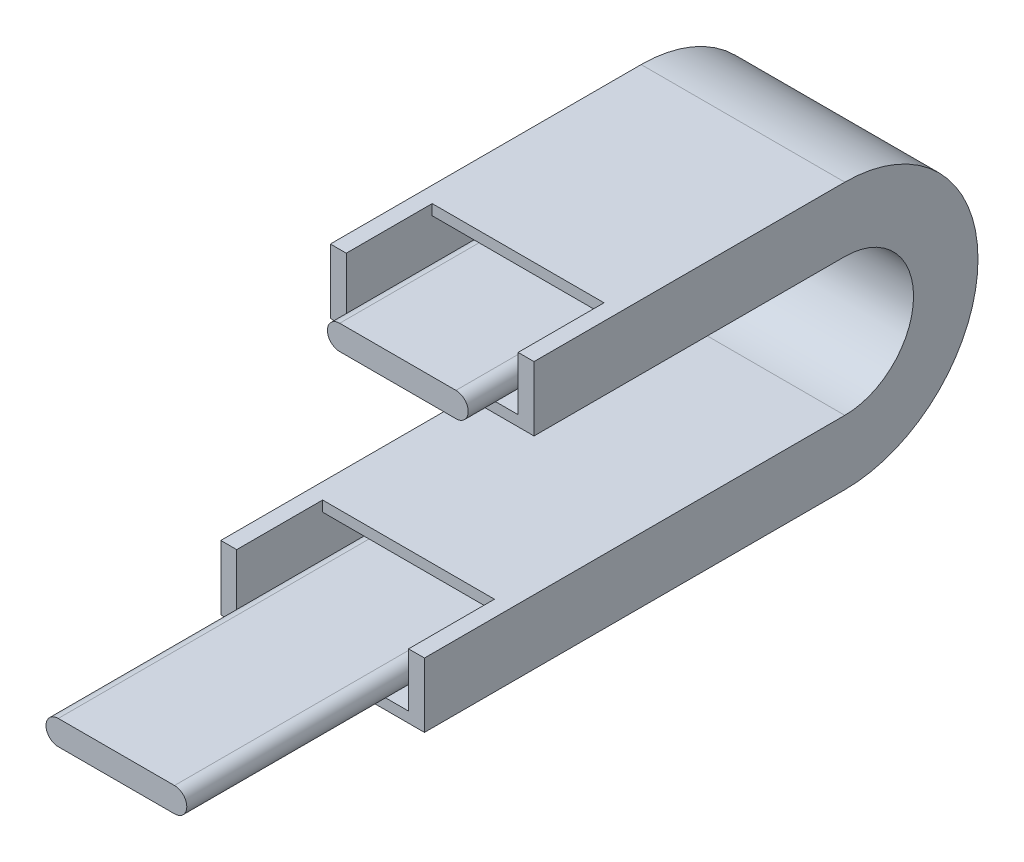
ISO-10303-21;
HEADER;
FILE_DESCRIPTION(('STEP AP214'),'2;1');
FILE_NAME('part.step','',(''),(''),'','','');
FILE_SCHEMA(('AUTOMOTIVE_DESIGN { 1 0 10303 214 1 1 1 1 }'));
ENDSEC;
DATA;
#1=APPLICATION_CONTEXT('core data for automotive mechanical design processes');
#2=APPLICATION_PROTOCOL_DEFINITION('international standard','automotive_design',2000,#1);
#3=PRODUCT_CONTEXT('',#1,'mechanical');
#4=PRODUCT('Part','Part','',(#3));
#5=PRODUCT_RELATED_PRODUCT_CATEGORY('part','',(#4));
#6=PRODUCT_DEFINITION_FORMATION('','',#4);
#7=PRODUCT_DEFINITION_CONTEXT('part definition',#1,'design');
#8=PRODUCT_DEFINITION('design','',#6,#7);
#9=PRODUCT_DEFINITION_SHAPE('','',#8);
#10=(LENGTH_UNIT() NAMED_UNIT(*) SI_UNIT(.MILLI.,.METRE.));
#11=(NAMED_UNIT(*) PLANE_ANGLE_UNIT() SI_UNIT($,.RADIAN.));
#12=(NAMED_UNIT(*) SI_UNIT($,.STERADIAN.) SOLID_ANGLE_UNIT());
#13=UNCERTAINTY_MEASURE_WITH_UNIT(LENGTH_MEASURE(1.E-05),#10,'distance_accuracy_value','');
#14=(GEOMETRIC_REPRESENTATION_CONTEXT(3) GLOBAL_UNCERTAINTY_ASSIGNED_CONTEXT((#13)) GLOBAL_UNIT_ASSIGNED_CONTEXT((#10,
#11,#12)) REPRESENTATION_CONTEXT('',''));
#15=CARTESIAN_POINT('',(0.,0.,0.));
#16=DIRECTION('',(0.,0.,1.));
#17=DIRECTION('',(1.,0.,0.));
#18=AXIS2_PLACEMENT_3D('',#15,#16,#17);
#19=CARTESIAN_POINT('',(-13.5255,41.8999999999999,-75.8362863203199));
#20=DIRECTION('',(0.,1.,0.));
#21=DIRECTION('',(0.,0.,1.));
#22=AXIS2_PLACEMENT_3D('',#19,#20,#21);
#23=PLANE('',#22);
#24=DIRECTION('',(-1.,0.,0.));
#25=VECTOR('',#24,1.);
#26=CARTESIAN_POINT('',(-13.5255,41.8999999999999,-75.8362863203199));
#27=LINE('',#26,#25);
#28=CARTESIAN_POINT('',(13.5255,41.8999999999999,-75.8362863203199));
#29=VERTEX_POINT('',#28);
#30=CARTESIAN_POINT('',(-13.5255,41.8999999999999,-75.8362863203199));
#31=VERTEX_POINT('',#30);
#32=EDGE_CURVE('E167',#29,#31,#27,.T.);
#33=ORIENTED_EDGE('',*,*,#32,.F.);
#34=DIRECTION('',(0.,0.,1.));
#35=VECTOR('',#34,1.);
#36=CARTESIAN_POINT('',(13.5255,41.8999999999999,-75.8362863203199));
#37=LINE('',#36,#35);
#38=CARTESIAN_POINT('',(13.5255,41.8999999999999,4.50000000000001));
#39=VERTEX_POINT('',#38);
#40=EDGE_CURVE('E54',#29,#39,#37,.T.);
#41=ORIENTED_EDGE('',*,*,#40,.T.);
#42=DIRECTION('',(1.,0.,0.));
#43=VECTOR('',#42,1.);
#44=CARTESIAN_POINT('',(-13.5255,41.8999999999999,4.50000000000001));
#45=LINE('',#44,#43);
#46=CARTESIAN_POINT('',(-13.5255,41.8999999999999,4.50000000000001));
#47=VERTEX_POINT('',#46);
#48=EDGE_CURVE('E115',#47,#39,#45,.T.);
#49=ORIENTED_EDGE('',*,*,#48,.F.);
#50=DIRECTION('',(0.,0.,1.));
#51=VECTOR('',#50,1.);
#52=CARTESIAN_POINT('',(-13.5255,41.8999999999999,-75.8362863203199));
#53=LINE('',#52,#51);
#54=EDGE_CURVE('E13',#31,#47,#53,.T.);
#55=ORIENTED_EDGE('',*,*,#54,.F.);
#56=EDGE_LOOP('',(#33,#41,#49,#55));
#57=FACE_BOUND('',#56,.T.);
#58=ADVANCED_FACE('F47',(#57),#23,.F.);
#59=CARTESIAN_POINT('',(13.5255,44.7575,-75.8362863203199));
#60=DIRECTION('',(0.,0.,1.));
#61=DIRECTION('',(0.,-1.,0.));
#62=AXIS2_PLACEMENT_3D('',#59,#60,#61);
#63=CYLINDRICAL_SURFACE('',#62,2.8575);
#64=CARTESIAN_POINT('',(13.5255,44.7575,-75.8362863203199));
#65=DIRECTION('',(0.,0.,-1.));
#66=DIRECTION('',(1.,0.,0.));
#67=AXIS2_PLACEMENT_3D('',#64,#65,#66);
#68=CIRCLE('',#67,2.8575);
#69=CARTESIAN_POINT('',(13.5255,47.615,-75.8362863203199));
#70=VERTEX_POINT('',#69);
#71=EDGE_CURVE('E164',#70,#29,#68,.T.);
#72=ORIENTED_EDGE('',*,*,#71,.F.);
#73=DIRECTION('',(0.,0.,1.));
#74=VECTOR('',#73,1.);
#75=CARTESIAN_POINT('',(13.5255,47.615,-75.8362863203199));
#76=LINE('',#75,#74);
#77=CARTESIAN_POINT('',(13.5255,47.6149999999999,4.50000000000001));
#78=VERTEX_POINT('',#77);
#79=EDGE_CURVE('E183',#70,#78,#76,.T.);
#80=ORIENTED_EDGE('',*,*,#79,.T.);
#81=CARTESIAN_POINT('',(13.5255,44.7574999999999,4.50000000000001));
#82=DIRECTION('',(0.,0.,1.));
#83=DIRECTION('',(1.,0.,0.));
#84=AXIS2_PLACEMENT_3D('',#81,#82,#83);
#85=CIRCLE('',#84,2.8575);
#86=EDGE_CURVE('E118',#39,#78,#85,.T.);
#87=ORIENTED_EDGE('',*,*,#86,.F.);
#88=ORIENTED_EDGE('',*,*,#40,.F.);
#89=EDGE_LOOP('',(#72,#80,#87,#88));
#90=FACE_BOUND('',#89,.T.);
#91=ADVANCED_FACE('F184',(#90),#63,.T.);
#92=CARTESIAN_POINT('',(-13.5255,47.615,-75.8362863203199));
#93=DIRECTION('',(0.,-1.,0.));
#94=DIRECTION('',(0.,0.,-1.));
#95=AXIS2_PLACEMENT_3D('',#92,#93,#94);
#96=PLANE('',#95);
#97=DIRECTION('',(1.,0.,0.));
#98=VECTOR('',#97,1.);
#99=CARTESIAN_POINT('',(-13.5255,47.615,-75.8362863203199));
#100=LINE('',#99,#98);
#101=CARTESIAN_POINT('',(-13.5255,47.615,-75.8362863203199));
#102=VERTEX_POINT('',#101);
#103=EDGE_CURVE('E161',#102,#70,#100,.T.);
#104=ORIENTED_EDGE('',*,*,#103,.F.);
#105=DIRECTION('',(0.,0.,1.));
#106=VECTOR('',#105,1.);
#107=CARTESIAN_POINT('',(-13.5255,47.615,-75.8362863203199));
#108=LINE('',#107,#106);
#109=CARTESIAN_POINT('',(-13.5255,47.6149999999999,4.50000000000001));
#110=VERTEX_POINT('',#109);
#111=EDGE_CURVE('E181',#102,#110,#108,.T.);
#112=ORIENTED_EDGE('',*,*,#111,.T.);
#113=DIRECTION('',(-1.,0.,0.));
#114=VECTOR('',#113,1.);
#115=CARTESIAN_POINT('',(13.5255,47.6149999999999,4.50000000000001));
#116=LINE('',#115,#114);
#117=EDGE_CURVE('E123',#78,#110,#116,.T.);
#118=ORIENTED_EDGE('',*,*,#117,.F.);
#119=ORIENTED_EDGE('',*,*,#79,.F.);
#120=EDGE_LOOP('',(#104,#112,#118,#119));
#121=FACE_BOUND('',#120,.T.);
#122=ADVANCED_FACE('F187',(#121),#96,.F.);
#123=CARTESIAN_POINT('',(-13.5255,44.7575,-75.8362863203199));
#124=DIRECTION('',(0.,0.,1.));
#125=DIRECTION('',(0.,-1.,0.));
#126=AXIS2_PLACEMENT_3D('',#123,#124,#125);
#127=CYLINDRICAL_SURFACE('',#126,2.8575);
#128=CARTESIAN_POINT('',(-13.5255,44.7575,-75.8362863203199));
#129=DIRECTION('',(0.,0.,-1.));
#130=DIRECTION('',(1.,0.,0.));
#131=AXIS2_PLACEMENT_3D('',#128,#129,#130);
#132=CIRCLE('',#131,2.8575);
#133=EDGE_CURVE('E112',#31,#102,#132,.T.);
#134=ORIENTED_EDGE('',*,*,#133,.F.);
#135=ORIENTED_EDGE('',*,*,#54,.T.);
#136=CARTESIAN_POINT('',(-13.5255,44.7574999999999,4.50000000000001));
#137=DIRECTION('',(0.,0.,1.));
#138=DIRECTION('',(1.,0.,0.));
#139=AXIS2_PLACEMENT_3D('',#136,#137,#138);
#140=CIRCLE('',#139,2.8575);
#141=EDGE_CURVE('E110',#110,#47,#140,.T.);
#142=ORIENTED_EDGE('',*,*,#141,.F.);
#143=ORIENTED_EDGE('',*,*,#111,.F.);
#144=EDGE_LOOP('',(#134,#135,#142,#143));
#145=FACE_BOUND('',#144,.T.);
#146=ADVANCED_FACE('F108',(#145),#127,.T.);
#147=CARTESIAN_POINT('',(0.,21.3075,-75.8362863203199));
#148=DIRECTION('',(1.,0.,0.));
#149=DIRECTION('',(0.,0.,-1.));
#150=AXIS2_PLACEMENT_3D('',#147,#148,#149);
#151=CYLINDRICAL_SURFACE('',#150,20.5925);
#152=DIRECTION('',(-1.,0.,0.));
#153=VECTOR('',#152,1.);
#154=CARTESIAN_POINT('',(-13.5255,0.715000000000009,-75.8362863203199));
#155=LINE('',#154,#153);
#156=CARTESIAN_POINT('',(13.5255,0.715000000000009,-75.8362863203199));
#157=VERTEX_POINT('',#156);
#158=CARTESIAN_POINT('',(-13.5255,0.715000000000009,-75.8362863203199));
#159=VERTEX_POINT('',#158);
#160=EDGE_CURVE('E149',#157,#159,#155,.T.);
#161=ORIENTED_EDGE('',*,*,#160,.F.);
#162=CARTESIAN_POINT('',(13.5255,21.3075,-75.8362863203199));
#163=DIRECTION('',(1.,0.,0.));
#164=DIRECTION('',(0.,0.,-1.));
#165=AXIS2_PLACEMENT_3D('',#162,#163,#164);
#166=CIRCLE('',#165,20.5925);
#167=EDGE_CURVE('E175',#157,#29,#166,.T.);
#168=ORIENTED_EDGE('',*,*,#167,.T.);
#169=ORIENTED_EDGE('',*,*,#32,.T.);
#170=CARTESIAN_POINT('',(-13.5255,21.3075,-75.8362863203199));
#171=DIRECTION('',(1.,0.,0.));
#172=DIRECTION('',(0.,0.,-1.));
#173=AXIS2_PLACEMENT_3D('',#170,#171,#172);
#174=CIRCLE('',#173,20.5925);
#175=EDGE_CURVE('E178',#159,#31,#174,.T.);
#176=ORIENTED_EDGE('',*,*,#175,.F.);
#177=EDGE_LOOP('',(#161,#168,#169,#176));
#178=FACE_BOUND('',#177,.T.);
#179=ADVANCED_FACE('F209',(#178),#151,.F.);
#180=CARTESIAN_POINT('',(13.5255,21.3075,-75.8362863203199));
#181=DIRECTION('',(1.,0.,0.));
#182=DIRECTION('',(0.,0.,-1.));
#183=AXIS2_PLACEMENT_3D('',#180,#181,#182);
#184=TOROIDAL_SURFACE('',#183,23.45,2.8575);
#185=CARTESIAN_POINT('',(13.5255,-2.14249999999999,-75.8362863203199));
#186=DIRECTION('',(0.,0.,1.));
#187=DIRECTION('',(1.,0.,0.));
#188=AXIS2_PLACEMENT_3D('',#185,#186,#187);
#189=CIRCLE('',#188,2.8575);
#190=CARTESIAN_POINT('',(13.5255,-4.99999999999999,-75.8362863203199));
#191=VERTEX_POINT('',#190);
#192=EDGE_CURVE('E146',#191,#157,#189,.T.);
#193=ORIENTED_EDGE('',*,*,#192,.F.);
#194=CARTESIAN_POINT('',(13.5255,21.3075,-75.8362863203199));
#195=DIRECTION('',(1.,0.,0.));
#196=DIRECTION('',(0.,0.,-1.));
#197=AXIS2_PLACEMENT_3D('',#194,#195,#196);
#198=CIRCLE('',#197,26.3075);
#199=EDGE_CURVE('E172',#191,#70,#198,.T.);
#200=ORIENTED_EDGE('',*,*,#199,.T.);
#201=ORIENTED_EDGE('',*,*,#71,.T.);
#202=ORIENTED_EDGE('',*,*,#167,.F.);
#203=EDGE_LOOP('',(#193,#200,#201,#202));
#204=FACE_BOUND('',#203,.T.);
#205=ADVANCED_FACE('F211',(#204),#184,.T.);
#206=CARTESIAN_POINT('',(0.,21.3075,-75.8362863203199));
#207=DIRECTION('',(1.,0.,0.));
#208=DIRECTION('',(0.,0.,-1.));
#209=AXIS2_PLACEMENT_3D('',#206,#207,#208);
#210=CYLINDRICAL_SURFACE('',#209,26.3075);
#211=DIRECTION('',(1.,0.,0.));
#212=VECTOR('',#211,1.);
#213=CARTESIAN_POINT('',(-13.5255,-4.99999999999999,-75.8362863203199));
#214=LINE('',#213,#212);
#215=CARTESIAN_POINT('',(-13.5255,-4.99999999999999,-75.8362863203199));
#216=VERTEX_POINT('',#215);
#217=EDGE_CURVE('E143',#216,#191,#214,.T.);
#218=ORIENTED_EDGE('',*,*,#217,.F.);
#219=CARTESIAN_POINT('',(-13.5255,21.3075,-75.8362863203199));
#220=DIRECTION('',(1.,0.,0.));
#221=DIRECTION('',(0.,0.,-1.));
#222=AXIS2_PLACEMENT_3D('',#219,#220,#221);
#223=CIRCLE('',#222,26.3075);
#224=EDGE_CURVE('E169',#216,#102,#223,.T.);
#225=ORIENTED_EDGE('',*,*,#224,.T.);
#226=ORIENTED_EDGE('',*,*,#103,.T.);
#227=ORIENTED_EDGE('',*,*,#199,.F.);
#228=EDGE_LOOP('',(#218,#225,#226,#227));
#229=FACE_BOUND('',#228,.T.);
#230=ADVANCED_FACE('F193',(#229),#210,.T.);
#231=CARTESIAN_POINT('',(-13.5255,21.3075,-75.8362863203199));
#232=DIRECTION('',(1.,0.,0.));
#233=DIRECTION('',(0.,0.,-1.));
#234=AXIS2_PLACEMENT_3D('',#231,#232,#233);
#235=TOROIDAL_SURFACE('',#234,23.45,2.8575);
#236=CARTESIAN_POINT('',(-13.5255,-2.14249999999999,-75.8362863203199));
#237=DIRECTION('',(0.,0.,1.));
#238=DIRECTION('',(1.,0.,0.));
#239=AXIS2_PLACEMENT_3D('',#236,#237,#238);
#240=CIRCLE('',#239,2.8575);
#241=EDGE_CURVE('E132',#159,#216,#240,.T.);
#242=ORIENTED_EDGE('',*,*,#241,.F.);
#243=ORIENTED_EDGE('',*,*,#175,.T.);
#244=ORIENTED_EDGE('',*,*,#133,.T.);
#245=ORIENTED_EDGE('',*,*,#224,.F.);
#246=EDGE_LOOP('',(#242,#243,#244,#245));
#247=FACE_BOUND('',#246,.T.);
#248=ADVANCED_FACE('F191',(#247),#235,.T.);
#249=CARTESIAN_POINT('',(-13.5255,-2.14249999999999,-75.8362863203199));
#250=DIRECTION('',(0.,0.,1.));
#251=DIRECTION('',(0.,-1.,0.));
#252=AXIS2_PLACEMENT_3D('',#249,#250,#251);
#253=CYLINDRICAL_SURFACE('',#252,2.8575);
#254=DIRECTION('',(0.,0.,1.));
#255=VECTOR('',#254,1.);
#256=CARTESIAN_POINT('',(-13.5255,-4.99999999999999,-75.8362863203199));
#257=LINE('',#256,#255);
#258=CARTESIAN_POINT('',(-13.5255,-4.99999999999999,70.));
#259=VERTEX_POINT('',#258);
#260=EDGE_CURVE('E152',#216,#259,#257,.T.);
#261=ORIENTED_EDGE('',*,*,#260,.T.);
#262=CARTESIAN_POINT('',(-13.5255,-2.14249999999999,70.));
#263=DIRECTION('',(0.,0.,1.));
#264=DIRECTION('',(1.,0.,0.));
#265=AXIS2_PLACEMENT_3D('',#262,#263,#264);
#266=CIRCLE('',#265,2.8575);
#267=CARTESIAN_POINT('',(-13.5255,0.714999999999995,70.));
#268=VERTEX_POINT('',#267);
#269=EDGE_CURVE('E129',#268,#259,#266,.T.);
#270=ORIENTED_EDGE('',*,*,#269,.F.);
#271=DIRECTION('',(0.,0.,1.));
#272=VECTOR('',#271,1.);
#273=CARTESIAN_POINT('',(-13.5255,0.715000000000009,-75.8362863203199));
#274=LINE('',#273,#272);
#275=EDGE_CURVE('E153',#159,#268,#274,.T.);
#276=ORIENTED_EDGE('',*,*,#275,.F.);
#277=ORIENTED_EDGE('',*,*,#241,.T.);
#278=EDGE_LOOP('',(#261,#270,#276,#277));
#279=FACE_BOUND('',#278,.T.);
#280=ADVANCED_FACE('F202',(#279),#253,.T.);
#281=CARTESIAN_POINT('',(-13.5255,0.715000000000009,-75.8362863203199));
#282=DIRECTION('',(0.,1.,0.));
#283=DIRECTION('',(0.,0.,1.));
#284=AXIS2_PLACEMENT_3D('',#281,#282,#283);
#285=PLANE('',#284);
#286=ORIENTED_EDGE('',*,*,#275,.T.);
#287=DIRECTION('',(-1.,0.,0.));
#288=VECTOR('',#287,1.);
#289=CARTESIAN_POINT('',(13.5255,0.714999999999995,70.));
#290=LINE('',#289,#288);
#291=CARTESIAN_POINT('',(13.5255,0.714999999999995,70.));
#292=VERTEX_POINT('',#291);
#293=EDGE_CURVE('E133',#292,#268,#290,.T.);
#294=ORIENTED_EDGE('',*,*,#293,.F.);
#295=DIRECTION('',(0.,0.,1.));
#296=VECTOR('',#295,1.);
#297=CARTESIAN_POINT('',(13.5255,0.715000000000009,-75.8362863203199));
#298=LINE('',#297,#296);
#299=EDGE_CURVE('E155',#157,#292,#298,.T.);
#300=ORIENTED_EDGE('',*,*,#299,.F.);
#301=ORIENTED_EDGE('',*,*,#160,.T.);
#302=EDGE_LOOP('',(#286,#294,#300,#301));
#303=FACE_BOUND('',#302,.T.);
#304=ADVANCED_FACE('F207',(#303),#285,.T.);
#305=CARTESIAN_POINT('',(13.5255,-2.14249999999999,-75.8362863203199));
#306=DIRECTION('',(0.,0.,1.));
#307=DIRECTION('',(0.,-1.,0.));
#308=AXIS2_PLACEMENT_3D('',#305,#306,#307);
#309=CYLINDRICAL_SURFACE('',#308,2.8575);
#310=ORIENTED_EDGE('',*,*,#299,.T.);
#311=CARTESIAN_POINT('',(13.5255,-2.14249999999999,70.));
#312=DIRECTION('',(0.,0.,1.));
#313=DIRECTION('',(1.,0.,0.));
#314=AXIS2_PLACEMENT_3D('',#311,#312,#313);
#315=CIRCLE('',#314,2.8575);
#316=CARTESIAN_POINT('',(13.5255,-5.,70.));
#317=VERTEX_POINT('',#316);
#318=EDGE_CURVE('E136',#317,#292,#315,.T.);
#319=ORIENTED_EDGE('',*,*,#318,.F.);
#320=DIRECTION('',(0.,0.,1.));
#321=VECTOR('',#320,1.);
#322=CARTESIAN_POINT('',(13.5255,-4.99999999999999,-75.8362863203199));
#323=LINE('',#322,#321);
#324=EDGE_CURVE('E157',#191,#317,#323,.T.);
#325=ORIENTED_EDGE('',*,*,#324,.F.);
#326=ORIENTED_EDGE('',*,*,#192,.T.);
#327=EDGE_LOOP('',(#310,#319,#325,#326));
#328=FACE_BOUND('',#327,.T.);
#329=ADVANCED_FACE('F215',(#328),#309,.T.);
#330=CARTESIAN_POINT('',(-13.5255,-4.99999999999999,-75.8362863203199));
#331=DIRECTION('',(0.,-1.,0.));
#332=DIRECTION('',(0.,0.,-1.));
#333=AXIS2_PLACEMENT_3D('',#330,#331,#332);
#334=PLANE('',#333);
#335=ORIENTED_EDGE('',*,*,#324,.T.);
#336=DIRECTION('',(1.,0.,0.));
#337=VECTOR('',#336,1.);
#338=CARTESIAN_POINT('',(-13.5255,-5.,70.));
#339=LINE('',#338,#337);
#340=EDGE_CURVE('E128',#259,#317,#339,.T.);
#341=ORIENTED_EDGE('',*,*,#340,.F.);
#342=ORIENTED_EDGE('',*,*,#260,.F.);
#343=ORIENTED_EDGE('',*,*,#217,.T.);
#344=EDGE_LOOP('',(#335,#341,#342,#343));
#345=FACE_BOUND('',#344,.T.);
#346=ADVANCED_FACE('F198',(#345),#334,.T.);
#347=CARTESIAN_POINT('',(0.,0.,70.));
#348=DIRECTION('',(0.,0.,1.));
#349=DIRECTION('',(1.,0.,0.));
#350=AXIS2_PLACEMENT_3D('',#347,#348,#349);
#351=PLANE('',#350);
#352=ORIENTED_EDGE('',*,*,#340,.T.);
#353=ORIENTED_EDGE('',*,*,#318,.T.);
#354=ORIENTED_EDGE('',*,*,#293,.T.);
#355=ORIENTED_EDGE('',*,*,#269,.T.);
#356=EDGE_LOOP('',(#352,#353,#354,#355));
#357=FACE_BOUND('',#356,.T.);
#358=ADVANCED_FACE('F217',(#357),#351,.T.);
#359=CARTESIAN_POINT('',(-13.5255,44.7574999999999,4.50000000000001));
#360=DIRECTION('',(0.,0.,1.));
#361=DIRECTION('',(1.,0.,0.));
#362=AXIS2_PLACEMENT_3D('',#359,#360,#361);
#363=PLANE('',#362);
#364=ORIENTED_EDGE('',*,*,#141,.T.);
#365=ORIENTED_EDGE('',*,*,#48,.T.);
#366=ORIENTED_EDGE('',*,*,#86,.T.);
#367=ORIENTED_EDGE('',*,*,#117,.T.);
#368=EDGE_LOOP('',(#364,#365,#366,#367));
#369=FACE_BOUND('',#368,.T.);
#370=ADVANCED_FACE('F121',(#369),#363,.T.);
#371=CLOSED_SHELL('',(#58,#91,#122,#146,#179,#205,#230,#248,#280,#304,#329,#346,#358,#370));
#372=MANIFOLD_SOLID_BREP('B2',#371);
#373=CARTESIAN_POINT('',(-50.3270539113887,54.5,-3.5));
#374=DIRECTION('',(0.,0.,1.));
#375=DIRECTION('',(0.,-1.,0.));
#376=AXIS2_PLACEMENT_3D('',#373,#374,#375);
#377=PLANE('',#376);
#378=DIRECTION('',(0.,1.,0.));
#379=VECTOR('',#378,1.);
#380=CARTESIAN_POINT('',(-20.,41.95,-3.5));
#381=LINE('',#380,#379);
#382=CARTESIAN_POINT('',(-20.,41.95,-3.5));
#383=VERTEX_POINT('',#382);
#384=CARTESIAN_POINT('',(-20.,54.5,-3.5));
#385=VERTEX_POINT('',#384);
#386=EDGE_CURVE('E635',#383,#385,#381,.T.);
#387=ORIENTED_EDGE('',*,*,#386,.T.);
#388=DIRECTION('',(1.,0.,0.));
#389=VECTOR('',#388,1.);
#390=CARTESIAN_POINT('',(-50.3270539113887,54.5,-3.5));
#391=LINE('',#390,#389);
#392=CARTESIAN_POINT('',(-23.7,54.5,-3.5));
#393=VERTEX_POINT('',#392);
#394=EDGE_CURVE('E632',#393,#385,#391,.T.);
#395=ORIENTED_EDGE('',*,*,#394,.F.);
#396=DIRECTION('',(0.,-1.,0.));
#397=VECTOR('',#396,1.);
#398=CARTESIAN_POINT('',(-23.7,54.5,-3.5));
#399=LINE('',#398,#397);
#400=CARTESIAN_POINT('',(-23.7,39.5,-3.5));
#401=VERTEX_POINT('',#400);
#402=EDGE_CURVE('E626',#393,#401,#399,.T.);
#403=ORIENTED_EDGE('',*,*,#402,.T.);
#404=DIRECTION('',(1.,0.,0.));
#405=VECTOR('',#404,1.);
#406=CARTESIAN_POINT('',(-50.3270539113887,39.5,-3.5));
#407=LINE('',#406,#405);
#408=CARTESIAN_POINT('',(23.7,39.5,-3.5));
#409=VERTEX_POINT('',#408);
#410=EDGE_CURVE('E616',#401,#409,#407,.T.);
#411=ORIENTED_EDGE('',*,*,#410,.T.);
#412=DIRECTION('',(0.,-1.,0.));
#413=VECTOR('',#412,1.);
#414=CARTESIAN_POINT('',(23.7,54.5,-3.5));
#415=LINE('',#414,#413);
#416=CARTESIAN_POINT('',(23.7,54.5,-3.5));
#417=VERTEX_POINT('',#416);
#418=EDGE_CURVE('E623',#417,#409,#415,.T.);
#419=ORIENTED_EDGE('',*,*,#418,.F.);
#420=CARTESIAN_POINT('',(20.,54.5,-3.5));
#421=VERTEX_POINT('',#420);
#422=EDGE_CURVE('E629',#421,#417,#391,.T.);
#423=ORIENTED_EDGE('',*,*,#422,.F.);
#424=DIRECTION('',(0.,-1.,0.));
#425=VECTOR('',#424,1.);
#426=CARTESIAN_POINT('',(20.,41.95,-3.5));
#427=LINE('',#426,#425);
#428=CARTESIAN_POINT('',(20.,41.95,-3.5));
#429=VERTEX_POINT('',#428);
#430=EDGE_CURVE('E630',#421,#429,#427,.T.);
#431=ORIENTED_EDGE('',*,*,#430,.T.);
#432=DIRECTION('',(-1.,0.,0.));
#433=VECTOR('',#432,1.);
#434=CARTESIAN_POINT('',(-20.,41.95,-3.5));
#435=LINE('',#434,#433);
#436=EDGE_CURVE('E660',#429,#383,#435,.T.);
#437=ORIENTED_EDGE('',*,*,#436,.T.);
#438=EDGE_LOOP('',(#387,#395,#403,#411,#419,#423,#431,#437));
#439=FACE_BOUND('',#438,.T.);
#440=ADVANCED_FACE('F359',(#439),#377,.T.);
#441=CARTESIAN_POINT('',(-23.7,-7.50000000000002,-75.8362863203199));
#442=DIRECTION('',(0.,-1.,0.));
#443=DIRECTION('',(0.,0.,-1.));
#444=AXIS2_PLACEMENT_3D('',#441,#442,#443);
#445=PLANE('',#444);
#446=DIRECTION('',(0.,0.,1.));
#447=VECTOR('',#446,1.);
#448=CARTESIAN_POINT('',(23.7,-7.50000000000002,-75.8362863203199));
#449=LINE('',#448,#447);
#450=CARTESIAN_POINT('',(23.7,-7.50000000000002,-75.8362863203199));
#451=VERTEX_POINT('',#450);
#452=CARTESIAN_POINT('',(23.7,-7.50000000000001,22.));
#453=VERTEX_POINT('',#452);
#454=EDGE_CURVE('E551',#451,#453,#449,.T.);
#455=ORIENTED_EDGE('',*,*,#454,.T.);
#456=DIRECTION('',(1.,0.,0.));
#457=VECTOR('',#456,1.);
#458=CARTESIAN_POINT('',(-50.3270539113887,-7.50000000000001,22.));
#459=LINE('',#458,#457);
#460=CARTESIAN_POINT('',(-23.7,-7.50000000000001,22.));
#461=VERTEX_POINT('',#460);
#462=EDGE_CURVE('E527',#461,#453,#459,.T.);
#463=ORIENTED_EDGE('',*,*,#462,.F.);
#464=DIRECTION('',(0.,0.,1.));
#465=VECTOR('',#464,1.);
#466=CARTESIAN_POINT('',(-23.7,-7.50000000000002,-75.8362863203199));
#467=LINE('',#466,#465);
#468=CARTESIAN_POINT('',(-23.7,-7.50000000000002,-75.8362863203199));
#469=VERTEX_POINT('',#468);
#470=EDGE_CURVE('E553',#469,#461,#467,.T.);
#471=ORIENTED_EDGE('',*,*,#470,.F.);
#472=DIRECTION('',(1.,0.,0.));
#473=VECTOR('',#472,1.);
#474=CARTESIAN_POINT('',(-23.7,-7.50000000000002,-75.8362863203199));
#475=LINE('',#474,#473);
#476=EDGE_CURVE('E540',#469,#451,#475,.T.);
#477=ORIENTED_EDGE('',*,*,#476,.T.);
#478=EDGE_LOOP('',(#455,#463,#471,#477));
#479=FACE_BOUND('',#478,.T.);
#480=ADVANCED_FACE('F648',(#479),#445,.T.);
#481=CARTESIAN_POINT('',(-50.3270539113887,7.49999999999999,22.));
#482=DIRECTION('',(0.,0.,1.));
#483=DIRECTION('',(1.,0.,0.));
#484=AXIS2_PLACEMENT_3D('',#481,#482,#483);
#485=PLANE('',#484);
#486=DIRECTION('',(0.,-1.,0.));
#487=VECTOR('',#486,1.);
#488=CARTESIAN_POINT('',(-20.,5.05,22.));
#489=LINE('',#488,#487);
#490=CARTESIAN_POINT('',(-20.,7.49999999999999,22.));
#491=VERTEX_POINT('',#490);
#492=CARTESIAN_POINT('',(-20.,-5.05,22.));
#493=VERTEX_POINT('',#492);
#494=EDGE_CURVE('E496',#491,#493,#489,.T.);
#495=ORIENTED_EDGE('',*,*,#494,.F.);
#496=DIRECTION('',(1.,0.,0.));
#497=VECTOR('',#496,1.);
#498=CARTESIAN_POINT('',(-50.3270539113887,7.49999999999999,22.));
#499=LINE('',#498,#497);
#500=CARTESIAN_POINT('',(-23.7,7.49999999999999,22.));
#501=VERTEX_POINT('',#500);
#502=EDGE_CURVE('E501',#501,#491,#499,.T.);
#503=ORIENTED_EDGE('',*,*,#502,.F.);
#504=DIRECTION('',(0.,-1.,0.));
#505=VECTOR('',#504,1.);
#506=CARTESIAN_POINT('',(-23.7,7.49999999999999,22.));
#507=LINE('',#506,#505);
#508=EDGE_CURVE('E524',#501,#461,#507,.T.);
#509=ORIENTED_EDGE('',*,*,#508,.T.);
#510=ORIENTED_EDGE('',*,*,#462,.T.);
#511=DIRECTION('',(0.,-1.,0.));
#512=VECTOR('',#511,1.);
#513=CARTESIAN_POINT('',(23.7,7.49999999999999,22.));
#514=LINE('',#513,#512);
#515=CARTESIAN_POINT('',(23.7,7.49999999999999,22.));
#516=VERTEX_POINT('',#515);
#517=EDGE_CURVE('E529',#516,#453,#514,.T.);
#518=ORIENTED_EDGE('',*,*,#517,.F.);
#519=CARTESIAN_POINT('',(20.,7.49999999999999,22.));
#520=VERTEX_POINT('',#519);
#521=EDGE_CURVE('E525',#520,#516,#499,.T.);
#522=ORIENTED_EDGE('',*,*,#521,.F.);
#523=DIRECTION('',(0.,1.,0.));
#524=VECTOR('',#523,1.);
#525=CARTESIAN_POINT('',(20.,5.05,22.));
#526=LINE('',#525,#524);
#527=CARTESIAN_POINT('',(20.,-5.05,22.));
#528=VERTEX_POINT('',#527);
#529=EDGE_CURVE('E667',#528,#520,#526,.T.);
#530=ORIENTED_EDGE('',*,*,#529,.F.);
#531=DIRECTION('',(1.,0.,0.));
#532=VECTOR('',#531,1.);
#533=CARTESIAN_POINT('',(-20.,-5.05,22.));
#534=LINE('',#533,#532);
#535=EDGE_CURVE('E504',#493,#528,#534,.T.);
#536=ORIENTED_EDGE('',*,*,#535,.F.);
#537=EDGE_LOOP('',(#495,#503,#509,#510,#518,#522,#530,#536));
#538=FACE_BOUND('',#537,.T.);
#539=ADVANCED_FACE('F498',(#538),#485,.T.);
#540=CARTESIAN_POINT('',(-23.7,7.49999999999998,-75.8362863203199));
#541=DIRECTION('',(0.,1.,0.));
#542=DIRECTION('',(0.,0.,1.));
#543=AXIS2_PLACEMENT_3D('',#540,#541,#542);
#544=PLANE('',#543);
#545=DIRECTION('',(0.,0.,1.));
#546=VECTOR('',#545,1.);
#547=CARTESIAN_POINT('',(-20.,7.49999999999999,22.));
#548=LINE('',#547,#546);
#549=CARTESIAN_POINT('',(-20.,7.5,2.));
#550=VERTEX_POINT('',#549);
#551=EDGE_CURVE('E510',#550,#491,#548,.T.);
#552=ORIENTED_EDGE('',*,*,#551,.F.);
#553=DIRECTION('',(-1.,0.,0.));
#554=VECTOR('',#553,1.);
#555=CARTESIAN_POINT('',(-20.,7.5,2.));
#556=LINE('',#555,#554);
#557=CARTESIAN_POINT('',(20.,7.5,2.));
#558=VERTEX_POINT('',#557);
#559=EDGE_CURVE('E686',#558,#550,#556,.T.);
#560=ORIENTED_EDGE('',*,*,#559,.F.);
#561=DIRECTION('',(0.,0.,-1.));
#562=VECTOR('',#561,1.);
#563=CARTESIAN_POINT('',(20.,7.49999999999999,22.));
#564=LINE('',#563,#562);
#565=EDGE_CURVE('E517',#520,#558,#564,.T.);
#566=ORIENTED_EDGE('',*,*,#565,.F.);
#567=ORIENTED_EDGE('',*,*,#521,.T.);
#568=DIRECTION('',(0.,0.,1.));
#569=VECTOR('',#568,1.);
#570=CARTESIAN_POINT('',(23.7,7.49999999999998,-75.8362863203199));
#571=LINE('',#570,#569);
#572=CARTESIAN_POINT('',(23.7,7.49999999999998,-75.8362863203199));
#573=VERTEX_POINT('',#572);
#574=EDGE_CURVE('E548',#573,#516,#571,.T.);
#575=ORIENTED_EDGE('',*,*,#574,.F.);
#576=DIRECTION('',(-1.,0.,0.));
#577=VECTOR('',#576,1.);
#578=CARTESIAN_POINT('',(-23.7,7.49999999999998,-75.8362863203199));
#579=LINE('',#578,#577);
#580=CARTESIAN_POINT('',(-23.7,7.49999999999998,-75.8362863203199));
#581=VERTEX_POINT('',#580);
#582=EDGE_CURVE('E543',#573,#581,#579,.T.);
#583=ORIENTED_EDGE('',*,*,#582,.T.);
#584=DIRECTION('',(0.,0.,1.));
#585=VECTOR('',#584,1.);
#586=CARTESIAN_POINT('',(-23.7,7.49999999999998,-75.8362863203199));
#587=LINE('',#586,#585);
#588=EDGE_CURVE('E522',#581,#501,#587,.T.);
#589=ORIENTED_EDGE('',*,*,#588,.T.);
#590=ORIENTED_EDGE('',*,*,#502,.T.);
#591=EDGE_LOOP('',(#552,#560,#566,#567,#575,#583,#589,#590));
#592=FACE_BOUND('',#591,.T.);
#593=ADVANCED_FACE('F519',(#592),#544,.T.);
#594=CARTESIAN_POINT('',(0.,23.5,-75.8362863203199));
#595=DIRECTION('',(1.,0.,0.));
#596=DIRECTION('',(0.,0.,-1.));
#597=AXIS2_PLACEMENT_3D('',#594,#595,#596);
#598=CYLINDRICAL_SURFACE('',#597,31.);
#599=ORIENTED_EDGE('',*,*,#476,.F.);
#600=CARTESIAN_POINT('',(-23.7,23.5,-75.8362863203199));
#601=DIRECTION('',(1.,0.,0.));
#602=DIRECTION('',(0.,0.,-1.));
#603=AXIS2_PLACEMENT_3D('',#600,#601,#602);
#604=CIRCLE('',#603,31.);
#605=CARTESIAN_POINT('',(-23.7,54.5,-75.8362863203199));
#606=VERTEX_POINT('',#605);
#607=EDGE_CURVE('E576',#469,#606,#604,.T.);
#608=ORIENTED_EDGE('',*,*,#607,.T.);
#609=DIRECTION('',(1.,0.,0.));
#610=VECTOR('',#609,1.);
#611=CARTESIAN_POINT('',(-23.7,54.5,-75.8362863203199));
#612=LINE('',#611,#610);
#613=CARTESIAN_POINT('',(23.7,54.5,-75.8362863203199));
#614=VERTEX_POINT('',#613);
#615=EDGE_CURVE('E569',#606,#614,#612,.T.);
#616=ORIENTED_EDGE('',*,*,#615,.T.);
#617=CARTESIAN_POINT('',(23.7,23.5,-75.8362863203199));
#618=DIRECTION('',(1.,0.,0.));
#619=DIRECTION('',(0.,0.,-1.));
#620=AXIS2_PLACEMENT_3D('',#617,#618,#619);
#621=CIRCLE('',#620,31.);
#622=EDGE_CURVE('E589',#451,#614,#621,.T.);
#623=ORIENTED_EDGE('',*,*,#622,.F.);
#624=EDGE_LOOP('',(#599,#608,#616,#623));
#625=FACE_BOUND('',#624,.T.);
#626=ADVANCED_FACE('F651',(#625),#598,.T.);
#627=CARTESIAN_POINT('',(0.,23.5,-75.8362863203199));
#628=DIRECTION('',(1.,0.,0.));
#629=DIRECTION('',(0.,0.,-1.));
#630=AXIS2_PLACEMENT_3D('',#627,#628,#629);
#631=CYLINDRICAL_SURFACE('',#630,16.);
#632=ORIENTED_EDGE('',*,*,#582,.F.);
#633=CARTESIAN_POINT('',(23.7,23.5,-75.8362863203199));
#634=DIRECTION('',(1.,0.,0.));
#635=DIRECTION('',(0.,0.,-1.));
#636=AXIS2_PLACEMENT_3D('',#633,#634,#635);
#637=CIRCLE('',#636,16.);
#638=CARTESIAN_POINT('',(23.7,39.5,-75.8362863203199));
#639=VERTEX_POINT('',#638);
#640=EDGE_CURVE('E592',#573,#639,#637,.T.);
#641=ORIENTED_EDGE('',*,*,#640,.T.);
#642=DIRECTION('',(-1.,0.,0.));
#643=VECTOR('',#642,1.);
#644=CARTESIAN_POINT('',(-23.7,39.5,-75.8362863203199));
#645=LINE('',#644,#643);
#646=CARTESIAN_POINT('',(-23.7,39.5,-75.8362863203199));
#647=VERTEX_POINT('',#646);
#648=EDGE_CURVE('E572',#639,#647,#645,.T.);
#649=ORIENTED_EDGE('',*,*,#648,.T.);
#650=CARTESIAN_POINT('',(-23.7,23.5,-75.8362863203199));
#651=DIRECTION('',(1.,0.,0.));
#652=DIRECTION('',(0.,0.,-1.));
#653=AXIS2_PLACEMENT_3D('',#650,#651,#652);
#654=CIRCLE('',#653,16.);
#655=EDGE_CURVE('E595',#581,#647,#654,.T.);
#656=ORIENTED_EDGE('',*,*,#655,.F.);
#657=EDGE_LOOP('',(#632,#641,#649,#656));
#658=FACE_BOUND('',#657,.T.);
#659=ADVANCED_FACE('F760',(#658),#631,.F.);
#660=CARTESIAN_POINT('',(-23.7,39.5,-75.8362863203199));
#661=DIRECTION('',(0.,1.,0.));
#662=DIRECTION('',(-1.,0.,0.));
#663=AXIS2_PLACEMENT_3D('',#660,#661,#662);
#664=PLANE('',#663);
#665=ORIENTED_EDGE('',*,*,#648,.F.);
#666=DIRECTION('',(0.,0.,1.));
#667=VECTOR('',#666,1.);
#668=CARTESIAN_POINT('',(23.7,39.5,-75.8362863203199));
#669=LINE('',#668,#667);
#670=EDGE_CURVE('E367',#639,#409,#669,.T.);
#671=ORIENTED_EDGE('',*,*,#670,.T.);
#672=ORIENTED_EDGE('',*,*,#410,.F.);
#673=DIRECTION('',(0.,0.,1.));
#674=VECTOR('',#673,1.);
#675=CARTESIAN_POINT('',(-23.7,39.5,-75.8362863203199));
#676=LINE('',#675,#674);
#677=EDGE_CURVE('E45',#647,#401,#676,.T.);
#678=ORIENTED_EDGE('',*,*,#677,.F.);
#679=EDGE_LOOP('',(#665,#671,#672,#678));
#680=FACE_BOUND('',#679,.T.);
#681=ADVANCED_FACE('F361',(#680),#664,.F.);
#682=CARTESIAN_POINT('',(-23.7,54.5,-75.8362863203199));
#683=DIRECTION('',(0.,-1.,0.));
#684=DIRECTION('',(0.,0.,-1.));
#685=AXIS2_PLACEMENT_3D('',#682,#683,#684);
#686=PLANE('',#685);
#687=ORIENTED_EDGE('',*,*,#394,.T.);
#688=DIRECTION('',(0.,0.,1.));
#689=VECTOR('',#688,1.);
#690=CARTESIAN_POINT('',(-20.,54.5,-3.5));
#691=LINE('',#690,#689);
#692=CARTESIAN_POINT('',(-20.,54.5,-23.5));
#693=VERTEX_POINT('',#692);
#694=EDGE_CURVE('E673',#693,#385,#691,.T.);
#695=ORIENTED_EDGE('',*,*,#694,.F.);
#696=DIRECTION('',(-1.,0.,0.));
#697=VECTOR('',#696,1.);
#698=CARTESIAN_POINT('',(-20.,54.5,-23.5));
#699=LINE('',#698,#697);
#700=CARTESIAN_POINT('',(20.,54.5,-23.5));
#701=VERTEX_POINT('',#700);
#702=EDGE_CURVE('E507',#701,#693,#699,.T.);
#703=ORIENTED_EDGE('',*,*,#702,.F.);
#704=DIRECTION('',(0.,0.,-1.));
#705=VECTOR('',#704,1.);
#706=CARTESIAN_POINT('',(20.,54.5,-3.5));
#707=LINE('',#706,#705);
#708=EDGE_CURVE('E657',#421,#701,#707,.T.);
#709=ORIENTED_EDGE('',*,*,#708,.F.);
#710=ORIENTED_EDGE('',*,*,#422,.T.);
#711=DIRECTION('',(0.,0.,1.));
#712=VECTOR('',#711,1.);
#713=CARTESIAN_POINT('',(23.7,54.5,-75.8362863203199));
#714=LINE('',#713,#712);
#715=EDGE_CURVE('E610',#614,#417,#714,.T.);
#716=ORIENTED_EDGE('',*,*,#715,.F.);
#717=ORIENTED_EDGE('',*,*,#615,.F.);
#718=DIRECTION('',(0.,0.,1.));
#719=VECTOR('',#718,1.);
#720=CARTESIAN_POINT('',(-23.7,54.5,-75.8362863203199));
#721=LINE('',#720,#719);
#722=EDGE_CURVE('E608',#606,#393,#721,.T.);
#723=ORIENTED_EDGE('',*,*,#722,.T.);
#724=EDGE_LOOP('',(#687,#695,#703,#709,#710,#716,#717,#723));
#725=FACE_BOUND('',#724,.T.);
#726=ADVANCED_FACE('F654',(#725),#686,.F.);
#727=CARTESIAN_POINT('',(23.7,7.49999999999998,-75.8362863203199));
#728=DIRECTION('',(1.,0.,0.));
#729=DIRECTION('',(0.,0.,-1.));
#730=AXIS2_PLACEMENT_3D('',#727,#728,#729);
#731=PLANE('',#730);
#732=ORIENTED_EDGE('',*,*,#574,.T.);
#733=ORIENTED_EDGE('',*,*,#517,.T.);
#734=ORIENTED_EDGE('',*,*,#454,.F.);
#735=ORIENTED_EDGE('',*,*,#622,.T.);
#736=ORIENTED_EDGE('',*,*,#715,.T.);
#737=ORIENTED_EDGE('',*,*,#418,.T.);
#738=ORIENTED_EDGE('',*,*,#670,.F.);
#739=ORIENTED_EDGE('',*,*,#640,.F.);
#740=EDGE_LOOP('',(#732,#733,#734,#735,#736,#737,#738,#739));
#741=FACE_BOUND('',#740,.T.);
#742=ADVANCED_FACE('F628',(#741),#731,.T.);
#743=CARTESIAN_POINT('',(-23.7,7.49999999999998,-75.8362863203199));
#744=DIRECTION('',(-1.,0.,0.));
#745=DIRECTION('',(0.,0.,1.));
#746=AXIS2_PLACEMENT_3D('',#743,#744,#745);
#747=PLANE('',#746);
#748=ORIENTED_EDGE('',*,*,#470,.T.);
#749=ORIENTED_EDGE('',*,*,#508,.F.);
#750=ORIENTED_EDGE('',*,*,#588,.F.);
#751=ORIENTED_EDGE('',*,*,#655,.T.);
#752=ORIENTED_EDGE('',*,*,#677,.T.);
#753=ORIENTED_EDGE('',*,*,#402,.F.);
#754=ORIENTED_EDGE('',*,*,#722,.F.);
#755=ORIENTED_EDGE('',*,*,#607,.F.);
#756=EDGE_LOOP('',(#748,#749,#750,#751,#752,#753,#754,#755));
#757=FACE_BOUND('',#756,.T.);
#758=ADVANCED_FACE('F724',(#757),#747,.T.);
#759=CARTESIAN_POINT('',(-20.,52.05,-75.8362863203199));
#760=DIRECTION('',(0.,-1.,0.));
#761=DIRECTION('',(1.,0.,0.));
#762=AXIS2_PLACEMENT_3D('',#759,#760,#761);
#763=PLANE('',#762);
#764=DIRECTION('',(-1.,0.,0.));
#765=VECTOR('',#764,1.);
#766=CARTESIAN_POINT('',(-20.,52.05,-23.5));
#767=LINE('',#766,#765);
#768=CARTESIAN_POINT('',(20.,52.05,-23.5));
#769=VERTEX_POINT('',#768);
#770=CARTESIAN_POINT('',(-20.,52.05,-23.5));
#771=VERTEX_POINT('',#770);
#772=EDGE_CURVE('E676',#769,#771,#767,.T.);
#773=ORIENTED_EDGE('',*,*,#772,.T.);
#774=DIRECTION('',(0.,0.,1.));
#775=VECTOR('',#774,1.);
#776=CARTESIAN_POINT('',(-20.,52.05,-75.8362863203199));
#777=LINE('',#776,#775);
#778=CARTESIAN_POINT('',(-20.,52.05,-75.8362863203199));
#779=VERTEX_POINT('',#778);
#780=EDGE_CURVE('E603',#779,#771,#777,.T.);
#781=ORIENTED_EDGE('',*,*,#780,.F.);
#782=DIRECTION('',(1.,0.,0.));
#783=VECTOR('',#782,1.);
#784=CARTESIAN_POINT('',(-20.,52.05,-75.8362863203199));
#785=LINE('',#784,#783);
#786=CARTESIAN_POINT('',(20.,52.05,-75.8362863203199));
#787=VERTEX_POINT('',#786);
#788=EDGE_CURVE('E565',#779,#787,#785,.T.);
#789=ORIENTED_EDGE('',*,*,#788,.T.);
#790=DIRECTION('',(0.,0.,1.));
#791=VECTOR('',#790,1.);
#792=CARTESIAN_POINT('',(20.,52.05,-75.8362863203199));
#793=LINE('',#792,#791);
#794=EDGE_CURVE('E600',#787,#769,#793,.T.);
#795=ORIENTED_EDGE('',*,*,#794,.T.);
#796=EDGE_LOOP('',(#773,#781,#789,#795));
#797=FACE_BOUND('',#796,.T.);
#798=ADVANCED_FACE('F728',(#797),#763,.T.);
#799=CARTESIAN_POINT('',(-20.,41.95,-75.8362863203199));
#800=DIRECTION('',(0.,1.,0.));
#801=DIRECTION('',(-1.,0.,0.));
#802=AXIS2_PLACEMENT_3D('',#799,#800,#801);
#803=PLANE('',#802);
#804=DIRECTION('',(-1.,0.,0.));
#805=VECTOR('',#804,1.);
#806=CARTESIAN_POINT('',(-20.,41.95,-75.8362863203199));
#807=LINE('',#806,#805);
#808=CARTESIAN_POINT('',(20.,41.95,-75.8362863203199));
#809=VERTEX_POINT('',#808);
#810=CARTESIAN_POINT('',(-20.,41.95,-75.8362863203199));
#811=VERTEX_POINT('',#810);
#812=EDGE_CURVE('E547',#809,#811,#807,.T.);
#813=ORIENTED_EDGE('',*,*,#812,.T.);
#814=DIRECTION('',(0.,0.,1.));
#815=VECTOR('',#814,1.);
#816=CARTESIAN_POINT('',(-20.,41.95,-75.8362863203199));
#817=LINE('',#816,#815);
#818=EDGE_CURVE('E606',#811,#383,#817,.T.);
#819=ORIENTED_EDGE('',*,*,#818,.T.);
#820=ORIENTED_EDGE('',*,*,#436,.F.);
#821=DIRECTION('',(0.,0.,1.));
#822=VECTOR('',#821,1.);
#823=CARTESIAN_POINT('',(20.,41.95,-75.8362863203199));
#824=LINE('',#823,#822);
#825=EDGE_CURVE('E598',#809,#429,#824,.T.);
#826=ORIENTED_EDGE('',*,*,#825,.F.);
#827=EDGE_LOOP('',(#813,#819,#820,#826));
#828=FACE_BOUND('',#827,.T.);
#829=ADVANCED_FACE('F665',(#828),#803,.T.);
#830=CARTESIAN_POINT('',(0.,23.5,-75.8362863203199));
#831=DIRECTION('',(1.,0.,0.));
#832=DIRECTION('',(0.,0.,-1.));
#833=AXIS2_PLACEMENT_3D('',#830,#831,#832);
#834=CYLINDRICAL_SURFACE('',#833,28.55);
#835=DIRECTION('',(1.,0.,0.));
#836=VECTOR('',#835,1.);
#837=CARTESIAN_POINT('',(-20.,-5.05000000000002,-75.8362863203199));
#838=LINE('',#837,#836);
#839=CARTESIAN_POINT('',(-20.,-5.05000000000002,-75.8362863203199));
#840=VERTEX_POINT('',#839);
#841=CARTESIAN_POINT('',(20.,-5.05000000000002,-75.8362863203199));
#842=VERTEX_POINT('',#841);
#843=EDGE_CURVE('E537',#840,#842,#838,.T.);
#844=ORIENTED_EDGE('',*,*,#843,.T.);
#845=CARTESIAN_POINT('',(20.,23.5,-75.8362863203199));
#846=DIRECTION('',(1.,0.,0.));
#847=DIRECTION('',(0.,0.,-1.));
#848=AXIS2_PLACEMENT_3D('',#845,#846,#847);
#849=CIRCLE('',#848,28.55);
#850=EDGE_CURVE('E579',#842,#787,#849,.T.);
#851=ORIENTED_EDGE('',*,*,#850,.T.);
#852=ORIENTED_EDGE('',*,*,#788,.F.);
#853=CARTESIAN_POINT('',(-20.,23.5,-75.8362863203199));
#854=DIRECTION('',(1.,0.,0.));
#855=DIRECTION('',(0.,0.,-1.));
#856=AXIS2_PLACEMENT_3D('',#853,#854,#855);
#857=CIRCLE('',#856,28.55);
#858=EDGE_CURVE('E582',#840,#779,#857,.T.);
#859=ORIENTED_EDGE('',*,*,#858,.F.);
#860=EDGE_LOOP('',(#844,#851,#852,#859));
#861=FACE_BOUND('',#860,.T.);
#862=ADVANCED_FACE('F700',(#861),#834,.F.);
#863=CARTESIAN_POINT('',(0.,23.5,-75.8362863203199));
#864=DIRECTION('',(1.,0.,0.));
#865=DIRECTION('',(0.,0.,-1.));
#866=AXIS2_PLACEMENT_3D('',#863,#864,#865);
#867=CYLINDRICAL_SURFACE('',#866,18.45);
#868=DIRECTION('',(-1.,0.,0.));
#869=VECTOR('',#868,1.);
#870=CARTESIAN_POINT('',(-20.,5.04999999999998,-75.8362863203199));
#871=LINE('',#870,#869);
#872=CARTESIAN_POINT('',(20.,5.04999999999998,-75.8362863203199));
#873=VERTEX_POINT('',#872);
#874=CARTESIAN_POINT('',(-20.,5.04999999999998,-75.8362863203199));
#875=VERTEX_POINT('',#874);
#876=EDGE_CURVE('E534',#873,#875,#871,.T.);
#877=ORIENTED_EDGE('',*,*,#876,.T.);
#878=CARTESIAN_POINT('',(-20.,23.5,-75.8362863203199));
#879=DIRECTION('',(1.,0.,0.));
#880=DIRECTION('',(0.,0.,-1.));
#881=AXIS2_PLACEMENT_3D('',#878,#879,#880);
#882=CIRCLE('',#881,18.45);
#883=EDGE_CURVE('E573',#875,#811,#882,.T.);
#884=ORIENTED_EDGE('',*,*,#883,.T.);
#885=ORIENTED_EDGE('',*,*,#812,.F.);
#886=CARTESIAN_POINT('',(20.,23.5,-75.8362863203199));
#887=DIRECTION('',(1.,0.,0.));
#888=DIRECTION('',(0.,0.,-1.));
#889=AXIS2_PLACEMENT_3D('',#886,#887,#888);
#890=CIRCLE('',#889,18.45);
#891=EDGE_CURVE('E568',#873,#809,#890,.T.);
#892=ORIENTED_EDGE('',*,*,#891,.F.);
#893=EDGE_LOOP('',(#877,#884,#885,#892));
#894=FACE_BOUND('',#893,.T.);
#895=ADVANCED_FACE('F698',(#894),#867,.T.);
#896=CARTESIAN_POINT('',(-20.,5.04999999999998,-75.8362863203199));
#897=DIRECTION('',(0.,1.,0.));
#898=DIRECTION('',(0.,0.,1.));
#899=AXIS2_PLACEMENT_3D('',#896,#897,#898);
#900=PLANE('',#899);
#901=DIRECTION('',(0.,0.,1.));
#902=VECTOR('',#901,1.);
#903=CARTESIAN_POINT('',(20.,5.04999999999998,-75.8362863203199));
#904=LINE('',#903,#902);
#905=CARTESIAN_POINT('',(20.,5.05,1.99999999999999));
#906=VERTEX_POINT('',#905);
#907=EDGE_CURVE('E545',#873,#906,#904,.T.);
#908=ORIENTED_EDGE('',*,*,#907,.T.);
#909=DIRECTION('',(1.,0.,0.));
#910=VECTOR('',#909,1.);
#911=CARTESIAN_POINT('',(-20.,5.05,2.));
#912=LINE('',#911,#910);
#913=CARTESIAN_POINT('',(-20.,5.04999999999999,2.));
#914=VERTEX_POINT('',#913);
#915=EDGE_CURVE('E374',#914,#906,#912,.T.);
#916=ORIENTED_EDGE('',*,*,#915,.F.);
#917=DIRECTION('',(0.,0.,1.));
#918=VECTOR('',#917,1.);
#919=CARTESIAN_POINT('',(-20.,5.04999999999998,-75.8362863203199));
#920=LINE('',#919,#918);
#921=EDGE_CURVE('E555',#875,#914,#920,.T.);
#922=ORIENTED_EDGE('',*,*,#921,.F.);
#923=ORIENTED_EDGE('',*,*,#876,.F.);
#924=EDGE_LOOP('',(#908,#916,#922,#923));
#925=FACE_BOUND('',#924,.T.);
#926=ADVANCED_FACE('F695',(#925),#900,.F.);
#927=CARTESIAN_POINT('',(-20.,5.04999999999998,-75.8362863203199));
#928=DIRECTION('',(-1.,0.,0.));
#929=DIRECTION('',(0.,0.,1.));
#930=AXIS2_PLACEMENT_3D('',#927,#928,#929);
#931=PLANE('',#930);
#932=ORIENTED_EDGE('',*,*,#921,.T.);
#933=DIRECTION('',(0.,1.,0.));
#934=VECTOR('',#933,1.);
#935=CARTESIAN_POINT('',(-20.,-7.50100000000007,1.99999999999999));
#936=LINE('',#935,#934);
#937=EDGE_CURVE('E513',#914,#550,#936,.T.);
#938=ORIENTED_EDGE('',*,*,#937,.T.);
#939=ORIENTED_EDGE('',*,*,#551,.T.);
#940=ORIENTED_EDGE('',*,*,#494,.T.);
#941=DIRECTION('',(0.,0.,1.));
#942=VECTOR('',#941,1.);
#943=CARTESIAN_POINT('',(-20.,-5.05000000000002,-75.8362863203199));
#944=LINE('',#943,#942);
#945=EDGE_CURVE('E557',#840,#493,#944,.T.);
#946=ORIENTED_EDGE('',*,*,#945,.F.);
#947=ORIENTED_EDGE('',*,*,#858,.T.);
#948=ORIENTED_EDGE('',*,*,#780,.T.);
#949=DIRECTION('',(0.,1.,0.));
#950=VECTOR('',#949,1.);
#951=CARTESIAN_POINT('',(-20.,-7.50100000000006,-23.5));
#952=LINE('',#951,#950);
#953=EDGE_CURVE('E674',#771,#693,#952,.T.);
#954=ORIENTED_EDGE('',*,*,#953,.T.);
#955=ORIENTED_EDGE('',*,*,#694,.T.);
#956=ORIENTED_EDGE('',*,*,#386,.F.);
#957=ORIENTED_EDGE('',*,*,#818,.F.);
#958=ORIENTED_EDGE('',*,*,#883,.F.);
#959=EDGE_LOOP('',(#932,#938,#939,#940,#946,#947,#948,#954,#955,#956,#957,#958));
#960=FACE_BOUND('',#959,.T.);
#961=ADVANCED_FACE('F512',(#960),#931,.F.);
#962=CARTESIAN_POINT('',(-20.,-5.05000000000002,-75.8362863203199));
#963=DIRECTION('',(0.,-1.,0.));
#964=DIRECTION('',(0.,0.,-1.));
#965=AXIS2_PLACEMENT_3D('',#962,#963,#964);
#966=PLANE('',#965);
#967=ORIENTED_EDGE('',*,*,#945,.T.);
#968=ORIENTED_EDGE('',*,*,#535,.T.);
#969=DIRECTION('',(0.,0.,1.));
#970=VECTOR('',#969,1.);
#971=CARTESIAN_POINT('',(20.,-5.05000000000002,-75.8362863203199));
#972=LINE('',#971,#970);
#973=EDGE_CURVE('E559',#842,#528,#972,.T.);
#974=ORIENTED_EDGE('',*,*,#973,.F.);
#975=ORIENTED_EDGE('',*,*,#843,.F.);
#976=EDGE_LOOP('',(#967,#968,#974,#975));
#977=FACE_BOUND('',#976,.T.);
#978=ADVANCED_FACE('F732',(#977),#966,.F.);
#979=CARTESIAN_POINT('',(20.,5.04999999999998,-75.8362863203199));
#980=DIRECTION('',(1.,0.,0.));
#981=DIRECTION('',(0.,0.,-1.));
#982=AXIS2_PLACEMENT_3D('',#979,#980,#981);
#983=PLANE('',#982);
#984=ORIENTED_EDGE('',*,*,#973,.T.);
#985=ORIENTED_EDGE('',*,*,#529,.T.);
#986=ORIENTED_EDGE('',*,*,#565,.T.);
#987=DIRECTION('',(0.,1.,0.));
#988=VECTOR('',#987,1.);
#989=CARTESIAN_POINT('',(20.,-7.50100000000007,1.99999999999999));
#990=LINE('',#989,#988);
#991=EDGE_CURVE('E684',#906,#558,#990,.T.);
#992=ORIENTED_EDGE('',*,*,#991,.F.);
#993=ORIENTED_EDGE('',*,*,#907,.F.);
#994=ORIENTED_EDGE('',*,*,#891,.T.);
#995=ORIENTED_EDGE('',*,*,#825,.T.);
#996=ORIENTED_EDGE('',*,*,#430,.F.);
#997=ORIENTED_EDGE('',*,*,#708,.T.);
#998=DIRECTION('',(0.,1.,0.));
#999=VECTOR('',#998,1.);
#1000=CARTESIAN_POINT('',(20.,-7.50100000000006,-23.5));
#1001=LINE('',#1000,#999);
#1002=EDGE_CURVE('E382',#769,#701,#1001,.T.);
#1003=ORIENTED_EDGE('',*,*,#1002,.F.);
#1004=ORIENTED_EDGE('',*,*,#794,.F.);
#1005=ORIENTED_EDGE('',*,*,#850,.F.);
#1006=EDGE_LOOP('',(#984,#985,#986,#992,#993,#994,#995,#996,#997,#1003,#1004,#1005));
#1007=FACE_BOUND('',#1006,.T.);
#1008=ADVANCED_FACE('F661',(#1007),#983,.F.);
#1009=CARTESIAN_POINT('',(-20.,-7.50100000000006,-23.5));
#1010=DIRECTION('',(0.,0.,-1.));
#1011=DIRECTION('',(0.,1.,0.));
#1012=AXIS2_PLACEMENT_3D('',#1009,#1010,#1011);
#1013=PLANE('',#1012);
#1014=ORIENTED_EDGE('',*,*,#1002,.T.);
#1015=ORIENTED_EDGE('',*,*,#702,.T.);
#1016=ORIENTED_EDGE('',*,*,#953,.F.);
#1017=ORIENTED_EDGE('',*,*,#772,.F.);
#1018=EDGE_LOOP('',(#1014,#1015,#1016,#1017));
#1019=FACE_BOUND('',#1018,.T.);
#1020=ADVANCED_FACE('F717',(#1019),#1013,.F.);
#1021=CARTESIAN_POINT('',(-20.,-7.50100000000007,1.99999999999999));
#1022=DIRECTION('',(0.,0.,-1.));
#1023=DIRECTION('',(0.,1.,0.));
#1024=AXIS2_PLACEMENT_3D('',#1021,#1022,#1023);
#1025=PLANE('',#1024);
#1026=ORIENTED_EDGE('',*,*,#915,.T.);
#1027=ORIENTED_EDGE('',*,*,#991,.T.);
#1028=ORIENTED_EDGE('',*,*,#559,.T.);
#1029=ORIENTED_EDGE('',*,*,#937,.F.);
#1030=EDGE_LOOP('',(#1026,#1027,#1028,#1029));
#1031=FACE_BOUND('',#1030,.T.);
#1032=ADVANCED_FACE('F692',(#1031),#1025,.F.);
#1033=CLOSED_SHELL('',(#440,#480,#539,#593,#626,#659,#681,#726,#742,#758,#798,#829,#862,#895,
#926,#961,#978,#1008,#1020,#1032));
#1034=MANIFOLD_SOLID_BREP('B7',#1033);
#1035=ADVANCED_BREP_SHAPE_REPRESENTATION('',(#18,#372,#1034),#14);
#1036=SHAPE_DEFINITION_REPRESENTATION(#9,#1035);
ENDSEC;
END-ISO-10303-21;
